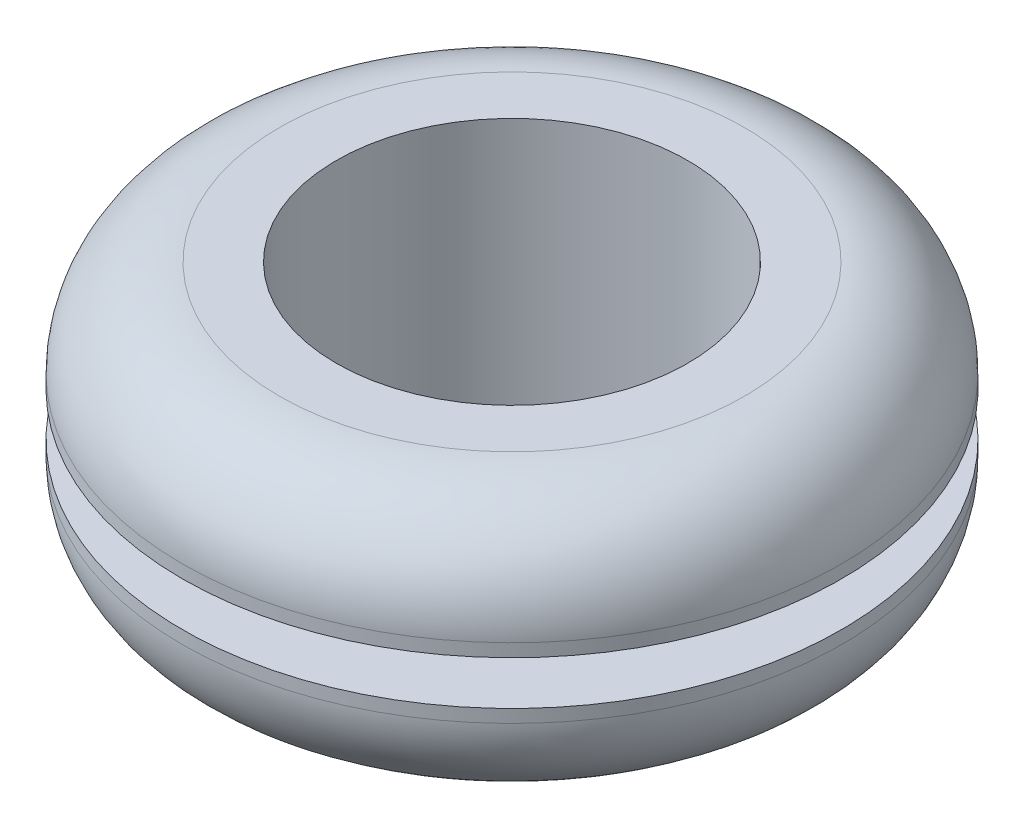
ISO-10303-21;
HEADER;
FILE_DESCRIPTION(('STEP AP214'),'2;1');
FILE_NAME('part.step','',(''),(''),'','','');
FILE_SCHEMA(('AUTOMOTIVE_DESIGN { 1 0 10303 214 1 1 1 1 }'));
ENDSEC;
DATA;
#1=APPLICATION_CONTEXT('core data for automotive mechanical design processes');
#2=APPLICATION_PROTOCOL_DEFINITION('international standard','automotive_design',2000,#1);
#3=PRODUCT_CONTEXT('',#1,'mechanical');
#4=PRODUCT('Part','Part','',(#3));
#5=PRODUCT_RELATED_PRODUCT_CATEGORY('part','',(#4));
#6=PRODUCT_DEFINITION_FORMATION('','',#4);
#7=PRODUCT_DEFINITION_CONTEXT('part definition',#1,'design');
#8=PRODUCT_DEFINITION('design','',#6,#7);
#9=PRODUCT_DEFINITION_SHAPE('','',#8);
#10=(LENGTH_UNIT() NAMED_UNIT(*) SI_UNIT(.MILLI.,.METRE.));
#11=(NAMED_UNIT(*) PLANE_ANGLE_UNIT() SI_UNIT($,.RADIAN.));
#12=(NAMED_UNIT(*) SI_UNIT($,.STERADIAN.) SOLID_ANGLE_UNIT());
#13=UNCERTAINTY_MEASURE_WITH_UNIT(LENGTH_MEASURE(1.E-05),#10,'distance_accuracy_value','');
#14=(GEOMETRIC_REPRESENTATION_CONTEXT(3) GLOBAL_UNCERTAINTY_ASSIGNED_CONTEXT((#13)) GLOBAL_UNIT_ASSIGNED_CONTEXT((#10,
#11,#12)) REPRESENTATION_CONTEXT('',''));
#15=CARTESIAN_POINT('',(0.,0.,0.));
#16=DIRECTION('',(0.,0.,1.));
#17=DIRECTION('',(1.,0.,0.));
#18=AXIS2_PLACEMENT_3D('',#15,#16,#17);
#19=CARTESIAN_POINT('',(0.,9.525,0.));
#20=DIRECTION('',(0.,-1.,0.));
#21=DIRECTION('',(0.,0.,-1.));
#22=AXIS2_PLACEMENT_3D('',#19,#20,#21);
#23=CYLINDRICAL_SURFACE('',#22,8.73125);
#24=CARTESIAN_POINT('',(0.,5.55625,0.));
#25=DIRECTION('',(0.,1.,0.));
#26=DIRECTION('',(0.,0.,1.));
#27=AXIS2_PLACEMENT_3D('',#24,#25,#26);
#28=CIRCLE('',#27,8.73125);
#29=CARTESIAN_POINT('',(0.,5.55625,-8.73125));
#30=VERTEX_POINT('',#29);
#31=EDGE_CURVE('E56',#30,#30,#28,.T.);
#32=CARTESIAN_POINT('',(0.,3.96875,0.));
#33=DIRECTION('',(0.,-1.,0.));
#34=DIRECTION('',(0.,0.,-1.));
#35=AXIS2_PLACEMENT_3D('',#32,#33,#34);
#36=CIRCLE('',#35,8.73125);
#37=CARTESIAN_POINT('',(0.,3.96875,-8.73125));
#38=VERTEX_POINT('',#37);
#39=EDGE_CURVE('E53',#38,#38,#36,.T.);
#40=CARTESIAN_POINT('',(0.,5.55625,-8.73125));
#41=CARTESIAN_POINT('',(0.,5.53971354166667,-8.73125));
#42=CARTESIAN_POINT('',(0.,5.52317708333333,-8.73125));
#43=CARTESIAN_POINT('',(0.,5.49010416666667,-8.73125));
#44=CARTESIAN_POINT('',(0.,5.47356770833333,-8.73125));
#45=CARTESIAN_POINT('',(0.,5.44049479166667,-8.73125));
#46=CARTESIAN_POINT('',(0.,5.42395833333333,-8.73125));
#47=CARTESIAN_POINT('',(0.,5.39088541666667,-8.73125));
#48=CARTESIAN_POINT('',(0.,5.37434895833333,-8.73125));
#49=CARTESIAN_POINT('',(0.,5.34127604166667,-8.73125));
#50=CARTESIAN_POINT('',(0.,5.32473958333333,-8.73125));
#51=CARTESIAN_POINT('',(0.,5.29166666666667,-8.73125));
#52=CARTESIAN_POINT('',(0.,5.27513020833333,-8.73125));
#53=CARTESIAN_POINT('',(0.,5.24205729166667,-8.73125));
#54=CARTESIAN_POINT('',(0.,5.22552083333333,-8.73125));
#55=CARTESIAN_POINT('',(0.,5.19244791666667,-8.73125));
#56=CARTESIAN_POINT('',(0.,5.17591145833333,-8.73125));
#57=CARTESIAN_POINT('',(0.,5.14283854166667,-8.73125));
#58=CARTESIAN_POINT('',(0.,5.12630208333333,-8.73125));
#59=CARTESIAN_POINT('',(0.,5.09322916666667,-8.73125));
#60=CARTESIAN_POINT('',(0.,5.07669270833333,-8.73125));
#61=CARTESIAN_POINT('',(0.,5.04361979166667,-8.73125));
#62=CARTESIAN_POINT('',(0.,5.02708333333333,-8.73125));
#63=CARTESIAN_POINT('',(0.,4.99401041666667,-8.73125));
#64=CARTESIAN_POINT('',(0.,4.97747395833333,-8.73125));
#65=CARTESIAN_POINT('',(0.,4.94440104166667,-8.73125));
#66=CARTESIAN_POINT('',(0.,4.92786458333333,-8.73125));
#67=CARTESIAN_POINT('',(0.,4.89479166666667,-8.73125));
#68=CARTESIAN_POINT('',(0.,4.87825520833333,-8.73125));
#69=CARTESIAN_POINT('',(0.,4.84518229166667,-8.73125));
#70=CARTESIAN_POINT('',(0.,4.82864583333333,-8.73125));
#71=CARTESIAN_POINT('',(0.,4.79557291666667,-8.73125));
#72=CARTESIAN_POINT('',(0.,4.77903645833333,-8.73125));
#73=CARTESIAN_POINT('',(0.,4.74596354166667,-8.73125));
#74=CARTESIAN_POINT('',(0.,4.72942708333333,-8.73125));
#75=CARTESIAN_POINT('',(0.,4.69635416666667,-8.73125));
#76=CARTESIAN_POINT('',(0.,4.67981770833333,-8.73125));
#77=CARTESIAN_POINT('',(0.,4.64674479166667,-8.73125));
#78=CARTESIAN_POINT('',(0.,4.63020833333333,-8.73125));
#79=CARTESIAN_POINT('',(0.,4.59713541666667,-8.73125));
#80=CARTESIAN_POINT('',(0.,4.58059895833333,-8.73125));
#81=CARTESIAN_POINT('',(0.,4.54752604166667,-8.73125));
#82=CARTESIAN_POINT('',(0.,4.53098958333333,-8.73125));
#83=CARTESIAN_POINT('',(0.,4.49791666666667,-8.73125));
#84=CARTESIAN_POINT('',(0.,4.48138020833333,-8.73125));
#85=CARTESIAN_POINT('',(0.,4.44830729166667,-8.73125));
#86=CARTESIAN_POINT('',(0.,4.43177083333333,-8.73125));
#87=CARTESIAN_POINT('',(0.,4.39869791666667,-8.73125));
#88=CARTESIAN_POINT('',(0.,4.38216145833333,-8.73125));
#89=CARTESIAN_POINT('',(0.,4.34908854166667,-8.73125));
#90=CARTESIAN_POINT('',(0.,4.33255208333333,-8.73125));
#91=CARTESIAN_POINT('',(0.,4.29947916666667,-8.73125));
#92=CARTESIAN_POINT('',(0.,4.28294270833333,-8.73125));
#93=CARTESIAN_POINT('',(0.,4.24986979166667,-8.73125));
#94=CARTESIAN_POINT('',(0.,4.23333333333333,-8.73125));
#95=CARTESIAN_POINT('',(0.,4.20026041666667,-8.73125));
#96=CARTESIAN_POINT('',(0.,4.18372395833333,-8.73125));
#97=CARTESIAN_POINT('',(0.,4.15065104166667,-8.73125));
#98=CARTESIAN_POINT('',(0.,4.13411458333333,-8.73125));
#99=CARTESIAN_POINT('',(0.,4.10104166666667,-8.73125));
#100=CARTESIAN_POINT('',(0.,4.08450520833333,-8.73125));
#101=CARTESIAN_POINT('',(0.,4.05143229166667,-8.73125));
#102=CARTESIAN_POINT('',(0.,4.03489583333333,-8.73125));
#103=CARTESIAN_POINT('',(0.,4.00182291666667,-8.73125));
#104=CARTESIAN_POINT('',(0.,3.98528645833333,-8.73125));
#105=CARTESIAN_POINT('',(0.,3.96875,-8.73125));
#106=B_SPLINE_CURVE_WITH_KNOTS('',3,(#40,#41,#42,#43,#44,#45,#46,#47,#48,#49,#50,#51,#52,#53,
#54,#55,#56,#57,#58,#59,#60,#61,#62,#63,#64,#65,#66,#67,#68,#69,#70,#71,#72,#73,#74,#75,#76,#77,
#78,#79,#80,#81,#82,#83,#84,#85,#86,#87,#88,#89,#90,#91,#92,#93,#94,#95,#96,#97,#98,#99,#100,
#101,#102,#103,#104,#105),.UNSPECIFIED.,.F.,.F.,(4,2,2,2,2,2,2,2,2,2,2,2,2,2,2,2,2,2,2,2,2,2,2,
2,2,2,2,2,2,2,2,2,4),(0.,0.0496093749999997,0.0992187499999995,0.148828125,0.1984375,
0.248046875,0.29765625,0.347265625,0.396875,0.446484374999999,0.496093749999999,0.545703125,
0.595312499999999,0.644921874999999,0.69453125,0.744140625,0.793749999999999,0.843359374999999,
0.892968749999999,0.942578124999999,0.992187499999999,1.041796875,1.09140625,1.141015625,
1.190625,1.240234375,1.28984375,1.339453125,1.3890625,1.438671875,1.48828125,1.537890625,
1.5875),.UNSPECIFIED.);
#107=EDGE_CURVE('BSEAM33',#30,#38,#106,.T.);
#108=ORIENTED_EDGE('',*,*,#31,.F.);
#109=ORIENTED_EDGE('',*,*,#39,.F.);
#110=ORIENTED_EDGE('',*,*,#107,.T.);
#111=ORIENTED_EDGE('',*,*,#107,.F.);
#112=EDGE_LOOP('',(#108,#110,#109,#111));
#113=FACE_BOUND('',#112,.T.);
#114=ADVANCED_FACE('F33',(#113),#23,.T.);
#115=CARTESIAN_POINT('',(0.,5.55625,0.));
#116=DIRECTION('',(0.,1.,0.));
#117=DIRECTION('',(0.,0.,1.));
#118=AXIS2_PLACEMENT_3D('',#115,#116,#117);
#119=CYLINDRICAL_SURFACE('',#118,11.90625);
#120=CARTESIAN_POINT('',(0.,6.025,0.));
#121=DIRECTION('',(0.,1.,0.));
#122=DIRECTION('',(0.,0.,1.));
#123=AXIS2_PLACEMENT_3D('',#120,#121,#122);
#124=CIRCLE('',#123,11.90625);
#125=CARTESIAN_POINT('',(0.,6.025,11.90625));
#126=VERTEX_POINT('',#125);
#127=EDGE_CURVE('E10',#126,#126,#124,.F.);
#128=ORIENTED_EDGE('',*,*,#127,.T.);
#129=EDGE_LOOP('',(#128));
#130=FACE_BOUND('',#129,.T.);
#131=CARTESIAN_POINT('',(0.,5.55625,0.));
#132=DIRECTION('',(0.,1.,0.));
#133=DIRECTION('',(0.,0.,1.));
#134=AXIS2_PLACEMENT_3D('',#131,#132,#133);
#135=CIRCLE('',#134,11.90625);
#136=CARTESIAN_POINT('',(0.,5.55625,11.90625));
#137=VERTEX_POINT('',#136);
#138=EDGE_CURVE('E59',#137,#137,#135,.T.);
#139=ORIENTED_EDGE('',*,*,#138,.T.);
#140=EDGE_LOOP('',(#139));
#141=FACE_BOUND('',#140,.T.);
#142=ADVANCED_FACE('F93',(#130,#141),#119,.T.);
#143=CARTESIAN_POINT('',(0.,5.55625,0.));
#144=DIRECTION('',(0.,1.,0.));
#145=DIRECTION('',(0.,0.,1.));
#146=AXIS2_PLACEMENT_3D('',#143,#144,#145);
#147=PLANE('',#146);
#148=ORIENTED_EDGE('',*,*,#31,.T.);
#149=EDGE_LOOP('',(#148));
#150=FACE_BOUND('',#149,.T.);
#151=ORIENTED_EDGE('',*,*,#138,.F.);
#152=EDGE_LOOP('',(#151));
#153=FACE_BOUND('',#152,.T.);
#154=ADVANCED_FACE('F84',(#150,#153),#147,.F.);
#155=CARTESIAN_POINT('',(0.,9.525,0.));
#156=DIRECTION('',(0.,1.,0.));
#157=DIRECTION('',(0.,0.,1.));
#158=AXIS2_PLACEMENT_3D('',#155,#156,#157);
#159=PLANE('',#158);
#160=CARTESIAN_POINT('',(0.,9.525,0.));
#161=DIRECTION('',(0.,1.,0.));
#162=DIRECTION('',(0.,0.,1.));
#163=AXIS2_PLACEMENT_3D('',#160,#161,#162);
#164=CIRCLE('',#163,8.40625);
#165=CARTESIAN_POINT('',(0.,9.525,8.40625));
#166=VERTEX_POINT('',#165);
#167=EDGE_CURVE('E40',#166,#166,#164,.T.);
#168=ORIENTED_EDGE('',*,*,#167,.T.);
#169=EDGE_LOOP('',(#168));
#170=FACE_BOUND('',#169,.T.);
#171=CARTESIAN_POINT('',(0.,9.525,0.));
#172=DIRECTION('',(0.,1.,0.));
#173=DIRECTION('',(0.,0.,1.));
#174=AXIS2_PLACEMENT_3D('',#171,#172,#173);
#175=CIRCLE('',#174,6.35);
#176=CARTESIAN_POINT('',(0.,9.525,6.35));
#177=VERTEX_POINT('',#176);
#178=EDGE_CURVE('E66',#177,#177,#175,.T.);
#179=ORIENTED_EDGE('',*,*,#178,.F.);
#180=EDGE_LOOP('',(#179));
#181=FACE_BOUND('',#180,.T.);
#182=ADVANCED_FACE('F81',(#170,#181),#159,.T.);
#183=CARTESIAN_POINT('',(0.,3.96875,0.));
#184=DIRECTION('',(0.,-1.,0.));
#185=DIRECTION('',(0.,0.,-1.));
#186=AXIS2_PLACEMENT_3D('',#183,#184,#185);
#187=CYLINDRICAL_SURFACE('',#186,11.90625);
#188=CARTESIAN_POINT('',(0.,3.5,0.));
#189=DIRECTION('',(0.,1.,0.));
#190=DIRECTION('',(0.,0.,1.));
#191=AXIS2_PLACEMENT_3D('',#188,#189,#190);
#192=CIRCLE('',#191,11.90625);
#193=CARTESIAN_POINT('',(0.,3.5,11.90625));
#194=VERTEX_POINT('',#193);
#195=EDGE_CURVE('E44',#194,#194,#192,.T.);
#196=ORIENTED_EDGE('',*,*,#195,.T.);
#197=EDGE_LOOP('',(#196));
#198=FACE_BOUND('',#197,.T.);
#199=CARTESIAN_POINT('',(0.,3.96875,0.));
#200=DIRECTION('',(0.,-1.,0.));
#201=DIRECTION('',(0.,0.,-1.));
#202=AXIS2_PLACEMENT_3D('',#199,#200,#201);
#203=CIRCLE('',#202,11.90625);
#204=CARTESIAN_POINT('',(0.,3.96875,-11.90625));
#205=VERTEX_POINT('',#204);
#206=EDGE_CURVE('E62',#205,#205,#203,.T.);
#207=ORIENTED_EDGE('',*,*,#206,.T.);
#208=EDGE_LOOP('',(#207));
#209=FACE_BOUND('',#208,.T.);
#210=ADVANCED_FACE('F83',(#198,#209),#187,.T.);
#211=CARTESIAN_POINT('',(0.,3.96875,0.));
#212=DIRECTION('',(0.,-1.,0.));
#213=DIRECTION('',(0.,0.,-1.));
#214=AXIS2_PLACEMENT_3D('',#211,#212,#213);
#215=PLANE('',#214);
#216=ORIENTED_EDGE('',*,*,#39,.T.);
#217=EDGE_LOOP('',(#216));
#218=FACE_BOUND('',#217,.T.);
#219=ORIENTED_EDGE('',*,*,#206,.F.);
#220=EDGE_LOOP('',(#219));
#221=FACE_BOUND('',#220,.T.);
#222=ADVANCED_FACE('F90',(#218,#221),#215,.F.);
#223=CARTESIAN_POINT('',(0.,0.,0.));
#224=DIRECTION('',(0.,1.,0.));
#225=DIRECTION('',(0.,0.,1.));
#226=AXIS2_PLACEMENT_3D('',#223,#224,#225);
#227=PLANE('',#226);
#228=CARTESIAN_POINT('',(0.,0.,0.));
#229=DIRECTION('',(0.,1.,0.));
#230=DIRECTION('',(0.,0.,1.));
#231=AXIS2_PLACEMENT_3D('',#228,#229,#230);
#232=CIRCLE('',#231,8.40625);
#233=CARTESIAN_POINT('',(0.,0.,8.40625));
#234=VERTEX_POINT('',#233);
#235=EDGE_CURVE('E48',#234,#234,#232,.F.);
#236=ORIENTED_EDGE('',*,*,#235,.T.);
#237=EDGE_LOOP('',(#236));
#238=FACE_BOUND('',#237,.T.);
#239=CARTESIAN_POINT('',(0.,0.,0.));
#240=DIRECTION('',(0.,1.,0.));
#241=DIRECTION('',(0.,0.,1.));
#242=AXIS2_PLACEMENT_3D('',#239,#240,#241);
#243=CIRCLE('',#242,6.35);
#244=CARTESIAN_POINT('',(0.,0.,6.35));
#245=VERTEX_POINT('',#244);
#246=EDGE_CURVE('E65',#245,#245,#243,.T.);
#247=ORIENTED_EDGE('',*,*,#246,.T.);
#248=EDGE_LOOP('',(#247));
#249=FACE_BOUND('',#248,.T.);
#250=ADVANCED_FACE('F72',(#238,#249),#227,.F.);
#251=CARTESIAN_POINT('',(0.,0.,0.));
#252=DIRECTION('',(0.,1.,0.));
#253=DIRECTION('',(0.,0.,1.));
#254=AXIS2_PLACEMENT_3D('',#251,#252,#253);
#255=CYLINDRICAL_SURFACE('',#254,6.35);
#256=CARTESIAN_POINT('',(0.,0.,6.35));
#257=CARTESIAN_POINT('',(0.,0.0992187499999999,6.35));
#258=CARTESIAN_POINT('',(0.,0.1984375,6.35));
#259=CARTESIAN_POINT('',(0.,0.396875,6.35));
#260=CARTESIAN_POINT('',(0.,0.49609375,6.35));
#261=CARTESIAN_POINT('',(0.,0.69453125,6.35));
#262=CARTESIAN_POINT('',(0.,0.79375,6.35));
#263=CARTESIAN_POINT('',(0.,0.9921875,6.35));
#264=CARTESIAN_POINT('',(0.,1.09140625,6.35));
#265=CARTESIAN_POINT('',(0.,1.28984375,6.35));
#266=CARTESIAN_POINT('',(0.,1.3890625,6.35));
#267=CARTESIAN_POINT('',(0.,1.5875,6.35));
#268=CARTESIAN_POINT('',(0.,1.68671875,6.35));
#269=CARTESIAN_POINT('',(0.,1.88515625,6.35));
#270=CARTESIAN_POINT('',(0.,1.984375,6.35));
#271=CARTESIAN_POINT('',(0.,2.1828125,6.35));
#272=CARTESIAN_POINT('',(0.,2.28203125,6.35));
#273=CARTESIAN_POINT('',(0.,2.48046875,6.35));
#274=CARTESIAN_POINT('',(0.,2.5796875,6.35));
#275=CARTESIAN_POINT('',(0.,2.778125,6.35));
#276=CARTESIAN_POINT('',(0.,2.87734375,6.35));
#277=CARTESIAN_POINT('',(0.,3.07578125,6.35));
#278=CARTESIAN_POINT('',(0.,3.175,6.35));
#279=CARTESIAN_POINT('',(0.,3.3734375,6.35));
#280=CARTESIAN_POINT('',(0.,3.47265625,6.35));
#281=CARTESIAN_POINT('',(0.,3.67109375,6.35));
#282=CARTESIAN_POINT('',(0.,3.7703125,6.35));
#283=CARTESIAN_POINT('',(0.,3.96875,6.35));
#284=CARTESIAN_POINT('',(0.,4.06796875,6.35));
#285=CARTESIAN_POINT('',(0.,4.26640625,6.35));
#286=CARTESIAN_POINT('',(0.,4.365625,6.35));
#287=CARTESIAN_POINT('',(0.,4.5640625,6.35));
#288=CARTESIAN_POINT('',(0.,4.66328125,6.35));
#289=CARTESIAN_POINT('',(0.,4.86171875,6.35));
#290=CARTESIAN_POINT('',(0.,4.9609375,6.35));
#291=CARTESIAN_POINT('',(0.,5.159375,6.35));
#292=CARTESIAN_POINT('',(0.,5.25859375,6.35));
#293=CARTESIAN_POINT('',(0.,5.45703125,6.35));
#294=CARTESIAN_POINT('',(0.,5.55625,6.35));
#295=CARTESIAN_POINT('',(0.,5.7546875,6.35));
#296=CARTESIAN_POINT('',(0.,5.85390625,6.35));
#297=CARTESIAN_POINT('',(0.,6.05234375,6.35));
#298=CARTESIAN_POINT('',(0.,6.1515625,6.35));
#299=CARTESIAN_POINT('',(0.,6.35,6.35));
#300=CARTESIAN_POINT('',(0.,6.44921875,6.35));
#301=CARTESIAN_POINT('',(0.,6.64765625,6.35));
#302=CARTESIAN_POINT('',(0.,6.746875,6.35));
#303=CARTESIAN_POINT('',(0.,6.9453125,6.35));
#304=CARTESIAN_POINT('',(0.,7.04453125,6.35));
#305=CARTESIAN_POINT('',(0.,7.24296875,6.35));
#306=CARTESIAN_POINT('',(0.,7.3421875,6.35));
#307=CARTESIAN_POINT('',(0.,7.540625,6.35));
#308=CARTESIAN_POINT('',(0.,7.63984375,6.35));
#309=CARTESIAN_POINT('',(0.,7.83828125,6.35));
#310=CARTESIAN_POINT('',(0.,7.9375,6.35));
#311=CARTESIAN_POINT('',(0.,8.1359375,6.35));
#312=CARTESIAN_POINT('',(0.,8.23515625,6.35));
#313=CARTESIAN_POINT('',(0.,8.43359375,6.35));
#314=CARTESIAN_POINT('',(0.,8.5328125,6.35));
#315=CARTESIAN_POINT('',(0.,8.73125,6.35));
#316=CARTESIAN_POINT('',(0.,8.83046875,6.35));
#317=CARTESIAN_POINT('',(0.,9.02890625,6.35));
#318=CARTESIAN_POINT('',(0.,9.128125,6.35));
#319=CARTESIAN_POINT('',(0.,9.3265625,6.35));
#320=CARTESIAN_POINT('',(0.,9.42578125,6.35));
#321=CARTESIAN_POINT('',(0.,9.525,6.35));
#322=B_SPLINE_CURVE_WITH_KNOTS('',3,(#256,#257,#258,#259,#260,#261,#262,#263,#264,#265,#266,
#267,#268,#269,#270,#271,#272,#273,#274,#275,#276,#277,#278,#279,#280,#281,#282,#283,#284,#285,
#286,#287,#288,#289,#290,#291,#292,#293,#294,#295,#296,#297,#298,#299,#300,#301,#302,#303,#304,
#305,#306,#307,#308,#309,#310,#311,#312,#313,#314,#315,#316,#317,#318,#319,#320,#321),
.UNSPECIFIED.,.F.,.F.,(4,2,2,2,2,2,2,2,2,2,2,2,2,2,2,2,2,2,2,2,2,2,2,2,2,2,2,2,2,2,2,2,4),(0.,
0.29765625,0.5953125,0.89296875,1.190625,1.48828125,1.7859375,2.08359375,2.38125,2.67890625,
2.9765625,3.27421875,3.571875,3.86953125,4.1671875,4.46484375,4.7625,5.06015625,5.3578125,
5.65546875,5.953125,6.25078125,6.5484375,6.84609375,7.14375,7.44140625,7.7390625,8.03671875,
8.334375,8.63203125,8.9296875,9.22734375,9.525),.UNSPECIFIED.);
#323=EDGE_CURVE('BSEAM74',#245,#177,#322,.T.);
#324=ORIENTED_EDGE('',*,*,#246,.F.);
#325=ORIENTED_EDGE('',*,*,#178,.T.);
#326=ORIENTED_EDGE('',*,*,#323,.T.);
#327=ORIENTED_EDGE('',*,*,#323,.F.);
#328=EDGE_LOOP('',(#324,#326,#325,#327));
#329=FACE_BOUND('',#328,.T.);
#330=ADVANCED_FACE('F74',(#329),#255,.F.);
#331=CARTESIAN_POINT('',(0.,3.5,0.));
#332=DIRECTION('',(0.,1.,0.));
#333=DIRECTION('',(0.,0.,1.));
#334=AXIS2_PLACEMENT_3D('',#331,#332,#333);
#335=TOROIDAL_SURFACE('',#334,8.40625,3.5);
#336=ORIENTED_EDGE('',*,*,#195,.F.);
#337=EDGE_LOOP('',(#336));
#338=FACE_BOUND('',#337,.T.);
#339=ORIENTED_EDGE('',*,*,#235,.F.);
#340=EDGE_LOOP('',(#339));
#341=FACE_BOUND('',#340,.T.);
#342=ADVANCED_FACE('F77',(#338,#341),#335,.T.);
#343=CARTESIAN_POINT('',(0.,6.025,0.));
#344=DIRECTION('',(0.,1.,0.));
#345=DIRECTION('',(0.,0.,1.));
#346=AXIS2_PLACEMENT_3D('',#343,#344,#345);
#347=TOROIDAL_SURFACE('',#346,8.40625,3.5);
#348=ORIENTED_EDGE('',*,*,#127,.F.);
#349=EDGE_LOOP('',(#348));
#350=FACE_BOUND('',#349,.T.);
#351=ORIENTED_EDGE('',*,*,#167,.F.);
#352=EDGE_LOOP('',(#351));
#353=FACE_BOUND('',#352,.T.);
#354=ADVANCED_FACE('F35',(#350,#353),#347,.T.);
#355=CLOSED_SHELL('',(#114,#142,#154,#182,#210,#222,#250,#330,#342,#354));
#356=MANIFOLD_SOLID_BREP('B2',#355);
#357=ADVANCED_BREP_SHAPE_REPRESENTATION('',(#18,#356),#14);
#358=SHAPE_DEFINITION_REPRESENTATION(#9,#357);
ENDSEC;
END-ISO-10303-21;
